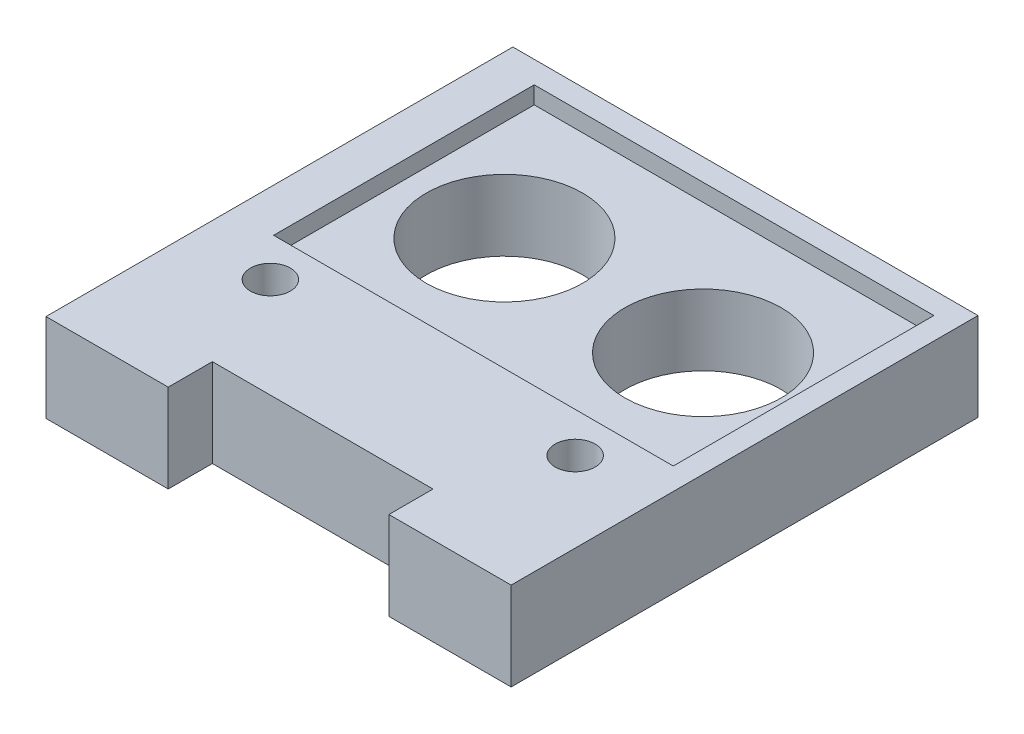
ISO-10303-21;
HEADER;
FILE_DESCRIPTION(('STEP AP214'),'2;1');
FILE_NAME('part.step','',(''),(''),'','','');
FILE_SCHEMA(('AUTOMOTIVE_DESIGN { 1 0 10303 214 1 1 1 1 }'));
ENDSEC;
DATA;
#1=APPLICATION_CONTEXT('core data for automotive mechanical design processes');
#2=APPLICATION_PROTOCOL_DEFINITION('international standard','automotive_design',2000,#1);
#3=PRODUCT_CONTEXT('',#1,'mechanical');
#4=PRODUCT('Part','Part','',(#3));
#5=PRODUCT_RELATED_PRODUCT_CATEGORY('part','',(#4));
#6=PRODUCT_DEFINITION_FORMATION('','',#4);
#7=PRODUCT_DEFINITION_CONTEXT('part definition',#1,'design');
#8=PRODUCT_DEFINITION('design','',#6,#7);
#9=PRODUCT_DEFINITION_SHAPE('','',#8);
#10=(LENGTH_UNIT() NAMED_UNIT(*) SI_UNIT(.MILLI.,.METRE.));
#11=(NAMED_UNIT(*) PLANE_ANGLE_UNIT() SI_UNIT($,.RADIAN.));
#12=(NAMED_UNIT(*) SI_UNIT($,.STERADIAN.) SOLID_ANGLE_UNIT());
#13=UNCERTAINTY_MEASURE_WITH_UNIT(LENGTH_MEASURE(1.E-05),#10,'distance_accuracy_value','');
#14=(GEOMETRIC_REPRESENTATION_CONTEXT(3) GLOBAL_UNCERTAINTY_ASSIGNED_CONTEXT((#13)) GLOBAL_UNIT_ASSIGNED_CONTEXT((#10,
#11,#12)) REPRESENTATION_CONTEXT('',''));
#15=CARTESIAN_POINT('',(0.,0.,0.));
#16=DIRECTION('',(0.,0.,1.));
#17=DIRECTION('',(1.,0.,0.));
#18=AXIS2_PLACEMENT_3D('',#15,#16,#17);
#19=CARTESIAN_POINT('',(-5.715,5.08,0.));
#20=DIRECTION('',(0.,-1.,0.));
#21=DIRECTION('',(0.,0.,-1.));
#22=AXIS2_PLACEMENT_3D('',#19,#20,#21);
#23=CYLINDRICAL_SURFACE('',#22,4.50000000000001);
#24=CARTESIAN_POINT('',(-5.715,0.,0.));
#25=DIRECTION('',(0.,1.,0.));
#26=DIRECTION('',(0.,0.,1.));
#27=AXIS2_PLACEMENT_3D('',#24,#25,#26);
#28=CIRCLE('',#27,4.50000000000001);
#29=CARTESIAN_POINT('',(-5.715,0.,4.50000000000001));
#30=VERTEX_POINT('',#29);
#31=EDGE_CURVE('E152',#30,#30,#28,.T.);
#32=ORIENTED_EDGE('',*,*,#31,.F.);
#33=EDGE_LOOP('',(#32));
#34=FACE_BOUND('',#33,.T.);
#35=CARTESIAN_POINT('',(-5.715,4.08,0.));
#36=DIRECTION('',(0.,1.,0.));
#37=DIRECTION('',(0.,0.,1.));
#38=AXIS2_PLACEMENT_3D('',#35,#36,#37);
#39=CIRCLE('',#38,4.50000000000001);
#40=CARTESIAN_POINT('',(-5.715,4.08,4.50000000000001));
#41=VERTEX_POINT('',#40);
#42=EDGE_CURVE('E216',#41,#41,#39,.T.);
#43=ORIENTED_EDGE('',*,*,#42,.T.);
#44=EDGE_LOOP('',(#43));
#45=FACE_BOUND('',#44,.T.);
#46=ADVANCED_FACE('F39',(#34,#45),#23,.F.);
#47=CARTESIAN_POINT('',(5.715,5.08,0.));
#48=DIRECTION('',(0.,-1.,0.));
#49=DIRECTION('',(0.,0.,-1.));
#50=AXIS2_PLACEMENT_3D('',#47,#48,#49);
#51=CYLINDRICAL_SURFACE('',#50,4.50000000000001);
#52=CARTESIAN_POINT('',(5.715,0.,0.));
#53=DIRECTION('',(0.,1.,0.));
#54=DIRECTION('',(0.,0.,1.));
#55=AXIS2_PLACEMENT_3D('',#52,#53,#54);
#56=CIRCLE('',#55,4.50000000000001);
#57=CARTESIAN_POINT('',(5.715,0.,4.5));
#58=VERTEX_POINT('',#57);
#59=EDGE_CURVE('E201',#58,#58,#56,.T.);
#60=ORIENTED_EDGE('',*,*,#59,.F.);
#61=EDGE_LOOP('',(#60));
#62=FACE_BOUND('',#61,.T.);
#63=CARTESIAN_POINT('',(5.715,4.08,0.));
#64=DIRECTION('',(0.,1.,0.));
#65=DIRECTION('',(0.,0.,1.));
#66=AXIS2_PLACEMENT_3D('',#63,#64,#65);
#67=CIRCLE('',#66,4.50000000000001);
#68=CARTESIAN_POINT('',(5.715,4.08,4.5));
#69=VERTEX_POINT('',#68);
#70=EDGE_CURVE('E43',#69,#69,#67,.T.);
#71=ORIENTED_EDGE('',*,*,#70,.T.);
#72=EDGE_LOOP('',(#71));
#73=FACE_BOUND('',#72,.T.);
#74=ADVANCED_FACE('F291',(#62,#73),#51,.F.);
#75=CARTESIAN_POINT('',(0.,5.08,0.));
#76=DIRECTION('',(0.,-1.,0.));
#77=DIRECTION('',(0.,0.,-1.));
#78=AXIS2_PLACEMENT_3D('',#75,#76,#77);
#79=PLANE('',#78);
#80=DIRECTION('',(-1.,0.,0.));
#81=VECTOR('',#80,1.);
#82=CARTESIAN_POINT('',(-11.5,5.08,-7.5));
#83=LINE('',#82,#81);
#84=CARTESIAN_POINT('',(11.5,5.08,-7.5));
#85=VERTEX_POINT('',#84);
#86=CARTESIAN_POINT('',(-11.5,5.08,-7.5));
#87=VERTEX_POINT('',#86);
#88=EDGE_CURVE('E239',#85,#87,#83,.T.);
#89=ORIENTED_EDGE('',*,*,#88,.F.);
#90=DIRECTION('',(0.,0.,-1.));
#91=VECTOR('',#90,1.);
#92=CARTESIAN_POINT('',(11.5,5.08,-7.5));
#93=LINE('',#92,#91);
#94=CARTESIAN_POINT('',(11.5,5.08,7.5));
#95=VERTEX_POINT('',#94);
#96=EDGE_CURVE('E54',#95,#85,#93,.T.);
#97=ORIENTED_EDGE('',*,*,#96,.F.);
#98=DIRECTION('',(1.,0.,0.));
#99=VECTOR('',#98,1.);
#100=CARTESIAN_POINT('',(-11.5,5.08,7.5));
#101=LINE('',#100,#99);
#102=CARTESIAN_POINT('',(-11.5,5.08,7.5));
#103=VERTEX_POINT('',#102);
#104=EDGE_CURVE('E234',#103,#95,#101,.T.);
#105=ORIENTED_EDGE('',*,*,#104,.F.);
#106=DIRECTION('',(0.,0.,1.));
#107=VECTOR('',#106,1.);
#108=CARTESIAN_POINT('',(-11.5,5.08,-7.5));
#109=LINE('',#108,#107);
#110=EDGE_CURVE('E237',#87,#103,#109,.T.);
#111=ORIENTED_EDGE('',*,*,#110,.F.);
#112=EDGE_LOOP('',(#89,#97,#105,#111));
#113=FACE_BOUND('',#112,.T.);
#114=DIRECTION('',(0.,0.,-1.));
#115=VECTOR('',#114,1.);
#116=CARTESIAN_POINT('',(-6.965,5.08,18.1));
#117=LINE('',#116,#115);
#118=CARTESIAN_POINT('',(-6.965,5.08,18.1));
#119=VERTEX_POINT('',#118);
#120=CARTESIAN_POINT('',(-6.965,5.08,15.56));
#121=VERTEX_POINT('',#120);
#122=EDGE_CURVE('E167',#119,#121,#117,.T.);
#123=ORIENTED_EDGE('',*,*,#122,.T.);
#124=DIRECTION('',(1.,0.,0.));
#125=VECTOR('',#124,1.);
#126=CARTESIAN_POINT('',(-6.965,5.08,15.56));
#127=LINE('',#126,#125);
#128=CARTESIAN_POINT('',(5.735,5.08,15.56));
#129=VERTEX_POINT('',#128);
#130=EDGE_CURVE('E104',#121,#129,#127,.T.);
#131=ORIENTED_EDGE('',*,*,#130,.T.);
#132=DIRECTION('',(0.,0.,1.));
#133=VECTOR('',#132,1.);
#134=CARTESIAN_POINT('',(5.735,5.08,18.1));
#135=LINE('',#134,#133);
#136=CARTESIAN_POINT('',(5.735,5.08,18.1));
#137=VERTEX_POINT('',#136);
#138=EDGE_CURVE('E185',#129,#137,#135,.T.);
#139=ORIENTED_EDGE('',*,*,#138,.T.);
#140=DIRECTION('',(1.,0.,0.));
#141=VECTOR('',#140,1.);
#142=CARTESIAN_POINT('',(5.735,5.08,18.1));
#143=LINE('',#142,#141);
#144=CARTESIAN_POINT('',(12.77,5.08,18.1));
#145=VERTEX_POINT('',#144);
#146=EDGE_CURVE('E191',#137,#145,#143,.T.);
#147=ORIENTED_EDGE('',*,*,#146,.T.);
#148=DIRECTION('',(0.,0.,-1.));
#149=VECTOR('',#148,1.);
#150=CARTESIAN_POINT('',(12.77,5.08,-8.77));
#151=LINE('',#150,#149);
#152=CARTESIAN_POINT('',(12.77,5.08,-8.77));
#153=VERTEX_POINT('',#152);
#154=EDGE_CURVE('E129',#145,#153,#151,.T.);
#155=ORIENTED_EDGE('',*,*,#154,.T.);
#156=DIRECTION('',(-1.,0.,0.));
#157=VECTOR('',#156,1.);
#158=CARTESIAN_POINT('',(-14.,5.08,-8.77));
#159=LINE('',#158,#157);
#160=CARTESIAN_POINT('',(-14.,5.08,-8.77));
#161=VERTEX_POINT('',#160);
#162=EDGE_CURVE('E123',#153,#161,#159,.T.);
#163=ORIENTED_EDGE('',*,*,#162,.T.);
#164=DIRECTION('',(0.,0.,1.));
#165=VECTOR('',#164,1.);
#166=CARTESIAN_POINT('',(-14.,5.08,-8.77));
#167=LINE('',#166,#165);
#168=CARTESIAN_POINT('',(-14.,5.08,18.1));
#169=VERTEX_POINT('',#168);
#170=EDGE_CURVE('E127',#161,#169,#167,.T.);
#171=ORIENTED_EDGE('',*,*,#170,.T.);
#172=DIRECTION('',(1.,0.,0.));
#173=VECTOR('',#172,1.);
#174=CARTESIAN_POINT('',(-14.,5.08,18.1));
#175=LINE('',#174,#173);
#176=EDGE_CURVE('E63',#169,#119,#175,.T.);
#177=ORIENTED_EDGE('',*,*,#176,.T.);
#178=EDGE_LOOP('',(#123,#131,#139,#147,#155,#163,#171,#177));
#179=FACE_BOUND('',#178,.T.);
#180=CARTESIAN_POINT('',(-9.384999986,5.08,9.8));
#181=DIRECTION('',(0.,1.,0.));
#182=DIRECTION('',(0.,0.,1.));
#183=AXIS2_PLACEMENT_3D('',#180,#181,#182);
#184=CIRCLE('',#183,1.15);
#185=CARTESIAN_POINT('',(-9.384999986,5.08,10.95));
#186=VERTEX_POINT('',#185);
#187=EDGE_CURVE('E206',#186,#186,#184,.T.);
#188=ORIENTED_EDGE('',*,*,#187,.F.);
#189=EDGE_LOOP('',(#188));
#190=FACE_BOUND('',#189,.T.);
#191=CARTESIAN_POINT('',(8.154999986,5.08,9.8));
#192=DIRECTION('',(0.,1.,0.));
#193=DIRECTION('',(0.,0.,1.));
#194=AXIS2_PLACEMENT_3D('',#191,#192,#193);
#195=CIRCLE('',#194,1.15);
#196=CARTESIAN_POINT('',(8.154999986,5.08,10.95));
#197=VERTEX_POINT('',#196);
#198=EDGE_CURVE('E209',#197,#197,#195,.T.);
#199=ORIENTED_EDGE('',*,*,#198,.F.);
#200=EDGE_LOOP('',(#199));
#201=FACE_BOUND('',#200,.T.);
#202=ADVANCED_FACE('F122',(#113,#179,#190,#201),#79,.F.);
#203=CARTESIAN_POINT('',(0.,0.,0.));
#204=DIRECTION('',(0.,-1.,0.));
#205=DIRECTION('',(0.,0.,-1.));
#206=AXIS2_PLACEMENT_3D('',#203,#204,#205);
#207=PLANE('',#206);
#208=CARTESIAN_POINT('',(-9.384999986,0.,9.8));
#209=DIRECTION('',(0.,1.,0.));
#210=DIRECTION('',(0.,0.,1.));
#211=AXIS2_PLACEMENT_3D('',#208,#209,#210);
#212=CIRCLE('',#211,1.15);
#213=CARTESIAN_POINT('',(-9.384999986,0.,10.95));
#214=VERTEX_POINT('',#213);
#215=EDGE_CURVE('E210',#214,#214,#212,.T.);
#216=ORIENTED_EDGE('',*,*,#215,.T.);
#217=EDGE_LOOP('',(#216));
#218=FACE_BOUND('',#217,.T.);
#219=ORIENTED_EDGE('',*,*,#31,.T.);
#220=EDGE_LOOP('',(#219));
#221=FACE_BOUND('',#220,.T.);
#222=DIRECTION('',(0.,0.,-1.));
#223=VECTOR('',#222,1.);
#224=CARTESIAN_POINT('',(-6.965,0.,18.1));
#225=LINE('',#224,#223);
#226=CARTESIAN_POINT('',(-6.965,0.,18.1));
#227=VERTEX_POINT('',#226);
#228=CARTESIAN_POINT('',(-6.965,0.,15.56));
#229=VERTEX_POINT('',#228);
#230=EDGE_CURVE('E147',#227,#229,#225,.T.);
#231=ORIENTED_EDGE('',*,*,#230,.F.);
#232=DIRECTION('',(1.,0.,0.));
#233=VECTOR('',#232,1.);
#234=CARTESIAN_POINT('',(-14.,0.,18.1));
#235=LINE('',#234,#233);
#236=CARTESIAN_POINT('',(-14.,0.,18.1));
#237=VERTEX_POINT('',#236);
#238=EDGE_CURVE('E100',#237,#227,#235,.T.);
#239=ORIENTED_EDGE('',*,*,#238,.F.);
#240=DIRECTION('',(0.,0.,1.));
#241=VECTOR('',#240,1.);
#242=CARTESIAN_POINT('',(-14.,0.,-8.77));
#243=LINE('',#242,#241);
#244=CARTESIAN_POINT('',(-14.,0.,-8.77));
#245=VERTEX_POINT('',#244);
#246=EDGE_CURVE('E162',#245,#237,#243,.T.);
#247=ORIENTED_EDGE('',*,*,#246,.F.);
#248=DIRECTION('',(-1.,0.,0.));
#249=VECTOR('',#248,1.);
#250=CARTESIAN_POINT('',(-14.,0.,-8.77));
#251=LINE('',#250,#249);
#252=CARTESIAN_POINT('',(12.77,0.,-8.77));
#253=VERTEX_POINT('',#252);
#254=EDGE_CURVE('E137',#253,#245,#251,.T.);
#255=ORIENTED_EDGE('',*,*,#254,.F.);
#256=DIRECTION('',(0.,0.,-1.));
#257=VECTOR('',#256,1.);
#258=CARTESIAN_POINT('',(12.77,0.,-8.77));
#259=LINE('',#258,#257);
#260=CARTESIAN_POINT('',(12.77,0.,18.1));
#261=VERTEX_POINT('',#260);
#262=EDGE_CURVE('E159',#261,#253,#259,.T.);
#263=ORIENTED_EDGE('',*,*,#262,.F.);
#264=DIRECTION('',(1.,0.,0.));
#265=VECTOR('',#264,1.);
#266=CARTESIAN_POINT('',(5.735,0.,18.1));
#267=LINE('',#266,#265);
#268=CARTESIAN_POINT('',(5.735,0.,18.1));
#269=VERTEX_POINT('',#268);
#270=EDGE_CURVE('E158',#269,#261,#267,.T.);
#271=ORIENTED_EDGE('',*,*,#270,.F.);
#272=DIRECTION('',(0.,0.,1.));
#273=VECTOR('',#272,1.);
#274=CARTESIAN_POINT('',(5.735,0.,18.1));
#275=LINE('',#274,#273);
#276=CARTESIAN_POINT('',(5.735,0.,15.56));
#277=VERTEX_POINT('',#276);
#278=EDGE_CURVE('E156',#277,#269,#275,.T.);
#279=ORIENTED_EDGE('',*,*,#278,.F.);
#280=DIRECTION('',(1.,0.,0.));
#281=VECTOR('',#280,1.);
#282=CARTESIAN_POINT('',(-6.965,0.,15.56));
#283=LINE('',#282,#281);
#284=EDGE_CURVE('E153',#229,#277,#283,.T.);
#285=ORIENTED_EDGE('',*,*,#284,.F.);
#286=EDGE_LOOP('',(#231,#239,#247,#255,#263,#271,#279,#285));
#287=FACE_BOUND('',#286,.T.);
#288=ORIENTED_EDGE('',*,*,#59,.T.);
#289=EDGE_LOOP('',(#288));
#290=FACE_BOUND('',#289,.T.);
#291=CARTESIAN_POINT('',(8.154999986,0.,9.8));
#292=DIRECTION('',(0.,1.,0.));
#293=DIRECTION('',(0.,0.,1.));
#294=AXIS2_PLACEMENT_3D('',#291,#292,#293);
#295=CIRCLE('',#294,1.15);
#296=CARTESIAN_POINT('',(8.154999986,0.,10.95));
#297=VERTEX_POINT('',#296);
#298=EDGE_CURVE('E213',#297,#297,#295,.T.);
#299=ORIENTED_EDGE('',*,*,#298,.T.);
#300=EDGE_LOOP('',(#299));
#301=FACE_BOUND('',#300,.T.);
#302=ADVANCED_FACE('F186',(#218,#221,#287,#290,#301),#207,.T.);
#303=CARTESIAN_POINT('',(-6.965,5.08,18.1));
#304=DIRECTION('',(-1.,0.,0.));
#305=DIRECTION('',(0.,0.,1.));
#306=AXIS2_PLACEMENT_3D('',#303,#304,#305);
#307=PLANE('',#306);
#308=ORIENTED_EDGE('',*,*,#230,.T.);
#309=DIRECTION('',(0.,-1.,0.));
#310=VECTOR('',#309,1.);
#311=CARTESIAN_POINT('',(-6.965,5.08,15.56));
#312=LINE('',#311,#310);
#313=EDGE_CURVE('E11',#121,#229,#312,.T.);
#314=ORIENTED_EDGE('',*,*,#313,.F.);
#315=ORIENTED_EDGE('',*,*,#122,.F.);
#316=DIRECTION('',(0.,-1.,0.));
#317=VECTOR('',#316,1.);
#318=CARTESIAN_POINT('',(-6.965,5.08,18.1));
#319=LINE('',#318,#317);
#320=EDGE_CURVE('E148',#119,#227,#319,.T.);
#321=ORIENTED_EDGE('',*,*,#320,.T.);
#322=EDGE_LOOP('',(#308,#314,#315,#321));
#323=FACE_BOUND('',#322,.T.);
#324=ADVANCED_FACE('F41',(#323),#307,.F.);
#325=CARTESIAN_POINT('',(-6.965,5.08,15.56));
#326=DIRECTION('',(0.,0.,-1.));
#327=DIRECTION('',(-1.,0.,0.));
#328=AXIS2_PLACEMENT_3D('',#325,#326,#327);
#329=PLANE('',#328);
#330=ORIENTED_EDGE('',*,*,#284,.T.);
#331=DIRECTION('',(0.,-1.,0.));
#332=VECTOR('',#331,1.);
#333=CARTESIAN_POINT('',(5.735,5.08,15.56));
#334=LINE('',#333,#332);
#335=EDGE_CURVE('E48',#129,#277,#334,.T.);
#336=ORIENTED_EDGE('',*,*,#335,.F.);
#337=ORIENTED_EDGE('',*,*,#130,.F.);
#338=ORIENTED_EDGE('',*,*,#313,.T.);
#339=EDGE_LOOP('',(#330,#336,#337,#338));
#340=FACE_BOUND('',#339,.T.);
#341=ADVANCED_FACE('F322',(#340),#329,.F.);
#342=CARTESIAN_POINT('',(5.735,5.08,18.1));
#343=DIRECTION('',(1.,0.,0.));
#344=DIRECTION('',(0.,0.,-1.));
#345=AXIS2_PLACEMENT_3D('',#342,#343,#344);
#346=PLANE('',#345);
#347=ORIENTED_EDGE('',*,*,#278,.T.);
#348=DIRECTION('',(0.,-1.,0.));
#349=VECTOR('',#348,1.);
#350=CARTESIAN_POINT('',(5.735,5.08,18.1));
#351=LINE('',#350,#349);
#352=EDGE_CURVE('E172',#137,#269,#351,.T.);
#353=ORIENTED_EDGE('',*,*,#352,.F.);
#354=ORIENTED_EDGE('',*,*,#138,.F.);
#355=ORIENTED_EDGE('',*,*,#335,.T.);
#356=EDGE_LOOP('',(#347,#353,#354,#355));
#357=FACE_BOUND('',#356,.T.);
#358=ADVANCED_FACE('F176',(#357),#346,.F.);
#359=CARTESIAN_POINT('',(5.735,5.08,18.1));
#360=DIRECTION('',(0.,0.,-1.));
#361=DIRECTION('',(-1.,0.,0.));
#362=AXIS2_PLACEMENT_3D('',#359,#360,#361);
#363=PLANE('',#362);
#364=ORIENTED_EDGE('',*,*,#270,.T.);
#365=DIRECTION('',(0.,-1.,0.));
#366=VECTOR('',#365,1.);
#367=CARTESIAN_POINT('',(12.77,5.08,18.1));
#368=LINE('',#367,#366);
#369=EDGE_CURVE('E168',#145,#261,#368,.T.);
#370=ORIENTED_EDGE('',*,*,#369,.F.);
#371=ORIENTED_EDGE('',*,*,#146,.F.);
#372=ORIENTED_EDGE('',*,*,#352,.T.);
#373=EDGE_LOOP('',(#364,#370,#371,#372));
#374=FACE_BOUND('',#373,.T.);
#375=ADVANCED_FACE('F193',(#374),#363,.F.);
#376=CARTESIAN_POINT('',(12.77,5.08,-8.77));
#377=DIRECTION('',(-1.,0.,0.));
#378=DIRECTION('',(0.,0.,1.));
#379=AXIS2_PLACEMENT_3D('',#376,#377,#378);
#380=PLANE('',#379);
#381=ORIENTED_EDGE('',*,*,#262,.T.);
#382=DIRECTION('',(0.,-1.,0.));
#383=VECTOR('',#382,1.);
#384=CARTESIAN_POINT('',(12.77,5.08,-8.77));
#385=LINE('',#384,#383);
#386=EDGE_CURVE('E143',#153,#253,#385,.T.);
#387=ORIENTED_EDGE('',*,*,#386,.F.);
#388=ORIENTED_EDGE('',*,*,#154,.F.);
#389=ORIENTED_EDGE('',*,*,#369,.T.);
#390=EDGE_LOOP('',(#381,#387,#388,#389));
#391=FACE_BOUND('',#390,.T.);
#392=ADVANCED_FACE('F195',(#391),#380,.F.);
#393=CARTESIAN_POINT('',(-14.,5.08,-8.77));
#394=DIRECTION('',(0.,0.,1.));
#395=DIRECTION('',(1.,0.,0.));
#396=AXIS2_PLACEMENT_3D('',#393,#394,#395);
#397=PLANE('',#396);
#398=ORIENTED_EDGE('',*,*,#254,.T.);
#399=DIRECTION('',(0.,-1.,0.));
#400=VECTOR('',#399,1.);
#401=CARTESIAN_POINT('',(-14.,5.08,-8.77));
#402=LINE('',#401,#400);
#403=EDGE_CURVE('E134',#161,#245,#402,.T.);
#404=ORIENTED_EDGE('',*,*,#403,.F.);
#405=ORIENTED_EDGE('',*,*,#162,.F.);
#406=ORIENTED_EDGE('',*,*,#386,.T.);
#407=EDGE_LOOP('',(#398,#404,#405,#406));
#408=FACE_BOUND('',#407,.T.);
#409=ADVANCED_FACE('F138',(#408),#397,.F.);
#410=CARTESIAN_POINT('',(-14.,5.08,-8.77));
#411=DIRECTION('',(1.,0.,0.));
#412=DIRECTION('',(0.,0.,-1.));
#413=AXIS2_PLACEMENT_3D('',#410,#411,#412);
#414=PLANE('',#413);
#415=ORIENTED_EDGE('',*,*,#246,.T.);
#416=DIRECTION('',(0.,-1.,0.));
#417=VECTOR('',#416,1.);
#418=CARTESIAN_POINT('',(-14.,5.08,18.1));
#419=LINE('',#418,#417);
#420=EDGE_CURVE('E142',#169,#237,#419,.T.);
#421=ORIENTED_EDGE('',*,*,#420,.F.);
#422=ORIENTED_EDGE('',*,*,#170,.F.);
#423=ORIENTED_EDGE('',*,*,#403,.T.);
#424=EDGE_LOOP('',(#415,#421,#422,#423));
#425=FACE_BOUND('',#424,.T.);
#426=ADVANCED_FACE('F145',(#425),#414,.F.);
#427=CARTESIAN_POINT('',(-14.,5.08,18.1));
#428=DIRECTION('',(0.,0.,-1.));
#429=DIRECTION('',(-1.,0.,0.));
#430=AXIS2_PLACEMENT_3D('',#427,#428,#429);
#431=PLANE('',#430);
#432=ORIENTED_EDGE('',*,*,#238,.T.);
#433=ORIENTED_EDGE('',*,*,#320,.F.);
#434=ORIENTED_EDGE('',*,*,#176,.F.);
#435=ORIENTED_EDGE('',*,*,#420,.T.);
#436=EDGE_LOOP('',(#432,#433,#434,#435));
#437=FACE_BOUND('',#436,.T.);
#438=ADVANCED_FACE('F313',(#437),#431,.F.);
#439=CARTESIAN_POINT('',(-9.384999986,5.08,9.8));
#440=DIRECTION('',(0.,-1.,0.));
#441=DIRECTION('',(0.,0.,-1.));
#442=AXIS2_PLACEMENT_3D('',#439,#440,#441);
#443=CYLINDRICAL_SURFACE('',#442,1.15);
#444=ORIENTED_EDGE('',*,*,#187,.T.);
#445=EDGE_LOOP('',(#444));
#446=FACE_BOUND('',#445,.T.);
#447=ORIENTED_EDGE('',*,*,#215,.F.);
#448=EDGE_LOOP('',(#447));
#449=FACE_BOUND('',#448,.T.);
#450=ADVANCED_FACE('F314',(#446,#449),#443,.F.);
#451=CARTESIAN_POINT('',(8.154999986,5.08,9.8));
#452=DIRECTION('',(0.,-1.,0.));
#453=DIRECTION('',(0.,0.,-1.));
#454=AXIS2_PLACEMENT_3D('',#451,#452,#453);
#455=CYLINDRICAL_SURFACE('',#454,1.15);
#456=ORIENTED_EDGE('',*,*,#198,.T.);
#457=EDGE_LOOP('',(#456));
#458=FACE_BOUND('',#457,.T.);
#459=ORIENTED_EDGE('',*,*,#298,.F.);
#460=EDGE_LOOP('',(#459));
#461=FACE_BOUND('',#460,.T.);
#462=ADVANCED_FACE('F354',(#458,#461),#455,.F.);
#463=CARTESIAN_POINT('',(11.5,4.08,-7.5));
#464=DIRECTION('',(1.,0.,0.));
#465=DIRECTION('',(0.,0.,-1.));
#466=AXIS2_PLACEMENT_3D('',#463,#464,#465);
#467=PLANE('',#466);
#468=ORIENTED_EDGE('',*,*,#96,.T.);
#469=DIRECTION('',(0.,1.,0.));
#470=VECTOR('',#469,1.);
#471=CARTESIAN_POINT('',(11.5,4.08,-7.5));
#472=LINE('',#471,#470);
#473=CARTESIAN_POINT('',(11.5,4.08,-7.5));
#474=VERTEX_POINT('',#473);
#475=EDGE_CURVE('E222',#474,#85,#472,.T.);
#476=ORIENTED_EDGE('',*,*,#475,.F.);
#477=DIRECTION('',(0.,0.,-1.));
#478=VECTOR('',#477,1.);
#479=CARTESIAN_POINT('',(11.5,4.08,-7.5));
#480=LINE('',#479,#478);
#481=CARTESIAN_POINT('',(11.5,4.08,7.5));
#482=VERTEX_POINT('',#481);
#483=EDGE_CURVE('E231',#482,#474,#480,.T.);
#484=ORIENTED_EDGE('',*,*,#483,.F.);
#485=DIRECTION('',(0.,1.,0.));
#486=VECTOR('',#485,1.);
#487=CARTESIAN_POINT('',(11.5,4.08,7.5));
#488=LINE('',#487,#486);
#489=EDGE_CURVE('E229',#482,#95,#488,.T.);
#490=ORIENTED_EDGE('',*,*,#489,.T.);
#491=EDGE_LOOP('',(#468,#476,#484,#490));
#492=FACE_BOUND('',#491,.T.);
#493=ADVANCED_FACE('F257',(#492),#467,.F.);
#494=CARTESIAN_POINT('',(-11.5,4.08,7.5));
#495=DIRECTION('',(0.,0.,1.));
#496=DIRECTION('',(1.,0.,0.));
#497=AXIS2_PLACEMENT_3D('',#494,#495,#496);
#498=PLANE('',#497);
#499=ORIENTED_EDGE('',*,*,#104,.T.);
#500=ORIENTED_EDGE('',*,*,#489,.F.);
#501=DIRECTION('',(1.,0.,0.));
#502=VECTOR('',#501,1.);
#503=CARTESIAN_POINT('',(-11.5,4.08,7.5));
#504=LINE('',#503,#502);
#505=CARTESIAN_POINT('',(-11.5,4.08,7.5));
#506=VERTEX_POINT('',#505);
#507=EDGE_CURVE('E221',#506,#482,#504,.T.);
#508=ORIENTED_EDGE('',*,*,#507,.F.);
#509=DIRECTION('',(0.,1.,0.));
#510=VECTOR('',#509,1.);
#511=CARTESIAN_POINT('',(-11.5,4.08,7.5));
#512=LINE('',#511,#510);
#513=EDGE_CURVE('E230',#506,#103,#512,.T.);
#514=ORIENTED_EDGE('',*,*,#513,.T.);
#515=EDGE_LOOP('',(#499,#500,#508,#514));
#516=FACE_BOUND('',#515,.T.);
#517=ADVANCED_FACE('F271',(#516),#498,.F.);
#518=CARTESIAN_POINT('',(-11.5,4.08,-7.5));
#519=DIRECTION('',(-1.,0.,0.));
#520=DIRECTION('',(0.,0.,1.));
#521=AXIS2_PLACEMENT_3D('',#518,#519,#520);
#522=PLANE('',#521);
#523=ORIENTED_EDGE('',*,*,#110,.T.);
#524=ORIENTED_EDGE('',*,*,#513,.F.);
#525=DIRECTION('',(0.,0.,1.));
#526=VECTOR('',#525,1.);
#527=CARTESIAN_POINT('',(-11.5,4.08,-7.5));
#528=LINE('',#527,#526);
#529=CARTESIAN_POINT('',(-11.5,4.08,-7.5));
#530=VERTEX_POINT('',#529);
#531=EDGE_CURVE('E244',#530,#506,#528,.T.);
#532=ORIENTED_EDGE('',*,*,#531,.F.);
#533=DIRECTION('',(0.,1.,0.));
#534=VECTOR('',#533,1.);
#535=CARTESIAN_POINT('',(-11.5,4.08,-7.5));
#536=LINE('',#535,#534);
#537=EDGE_CURVE('E224',#530,#87,#536,.T.);
#538=ORIENTED_EDGE('',*,*,#537,.T.);
#539=EDGE_LOOP('',(#523,#524,#532,#538));
#540=FACE_BOUND('',#539,.T.);
#541=ADVANCED_FACE('F277',(#540),#522,.F.);
#542=CARTESIAN_POINT('',(-11.5,4.08,-7.5));
#543=DIRECTION('',(0.,0.,-1.));
#544=DIRECTION('',(-1.,0.,0.));
#545=AXIS2_PLACEMENT_3D('',#542,#543,#544);
#546=PLANE('',#545);
#547=ORIENTED_EDGE('',*,*,#88,.T.);
#548=ORIENTED_EDGE('',*,*,#537,.F.);
#549=DIRECTION('',(-1.,0.,0.));
#550=VECTOR('',#549,1.);
#551=CARTESIAN_POINT('',(-11.5,4.08,-7.5));
#552=LINE('',#551,#550);
#553=EDGE_CURVE('E247',#474,#530,#552,.T.);
#554=ORIENTED_EDGE('',*,*,#553,.F.);
#555=ORIENTED_EDGE('',*,*,#475,.T.);
#556=EDGE_LOOP('',(#547,#548,#554,#555));
#557=FACE_BOUND('',#556,.T.);
#558=ADVANCED_FACE('F281',(#557),#546,.F.);
#559=CARTESIAN_POINT('',(0.,4.08,0.));
#560=DIRECTION('',(0.,1.,0.));
#561=DIRECTION('',(0.,0.,1.));
#562=AXIS2_PLACEMENT_3D('',#559,#560,#561);
#563=PLANE('',#562);
#564=ORIENTED_EDGE('',*,*,#42,.F.);
#565=EDGE_LOOP('',(#564));
#566=FACE_BOUND('',#565,.T.);
#567=ORIENTED_EDGE('',*,*,#70,.F.);
#568=EDGE_LOOP('',(#567));
#569=FACE_BOUND('',#568,.T.);
#570=ORIENTED_EDGE('',*,*,#483,.T.);
#571=ORIENTED_EDGE('',*,*,#553,.T.);
#572=ORIENTED_EDGE('',*,*,#531,.T.);
#573=ORIENTED_EDGE('',*,*,#507,.T.);
#574=EDGE_LOOP('',(#570,#571,#572,#573));
#575=FACE_BOUND('',#574,.T.);
#576=ADVANCED_FACE('F254',(#566,#569,#575),#563,.T.);
#577=CLOSED_SHELL('',(#46,#74,#202,#302,#324,#341,#358,#375,#392,#409,#426,#438,#450,#462,#493,
#517,#541,#558,#576));
#578=MANIFOLD_SOLID_BREP('B2',#577);
#579=ADVANCED_BREP_SHAPE_REPRESENTATION('',(#18,#578),#14);
#580=SHAPE_DEFINITION_REPRESENTATION(#9,#579);
ENDSEC;
END-ISO-10303-21;
